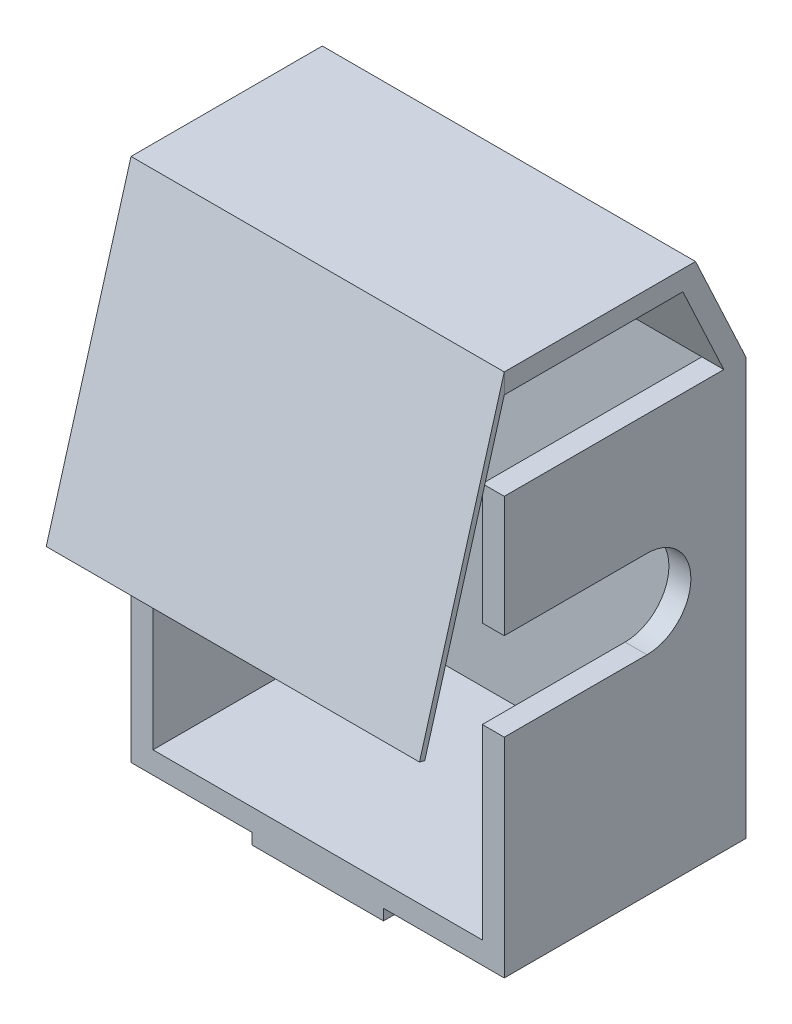
ISO-10303-21;
HEADER;
FILE_DESCRIPTION(('STEP AP214'),'2;1');
FILE_NAME('part.step','',(''),(''),'','','');
FILE_SCHEMA(('AUTOMOTIVE_DESIGN { 1 0 10303 214 1 1 1 1 }'));
ENDSEC;
DATA;
#1=APPLICATION_CONTEXT('core data for automotive mechanical design processes');
#2=APPLICATION_PROTOCOL_DEFINITION('international standard','automotive_design',2000,#1);
#3=PRODUCT_CONTEXT('',#1,'mechanical');
#4=PRODUCT('Part','Part','',(#3));
#5=PRODUCT_RELATED_PRODUCT_CATEGORY('part','',(#4));
#6=PRODUCT_DEFINITION_FORMATION('','',#4);
#7=PRODUCT_DEFINITION_CONTEXT('part definition',#1,'design');
#8=PRODUCT_DEFINITION('design','',#6,#7);
#9=PRODUCT_DEFINITION_SHAPE('','',#8);
#10=(LENGTH_UNIT() NAMED_UNIT(*) SI_UNIT(.MILLI.,.METRE.));
#11=(NAMED_UNIT(*) PLANE_ANGLE_UNIT() SI_UNIT($,.RADIAN.));
#12=(NAMED_UNIT(*) SI_UNIT($,.STERADIAN.) SOLID_ANGLE_UNIT());
#13=UNCERTAINTY_MEASURE_WITH_UNIT(LENGTH_MEASURE(1.E-05),#10,'distance_accuracy_value','');
#14=(GEOMETRIC_REPRESENTATION_CONTEXT(3) GLOBAL_UNCERTAINTY_ASSIGNED_CONTEXT((#13)) GLOBAL_UNIT_ASSIGNED_CONTEXT((#10,
#11,#12)) REPRESENTATION_CONTEXT('',''));
#15=CARTESIAN_POINT('',(0.,0.,0.));
#16=DIRECTION('',(0.,0.,1.));
#17=DIRECTION('',(1.,0.,0.));
#18=AXIS2_PLACEMENT_3D('',#15,#16,#17);
#19=CARTESIAN_POINT('',(-107.95,138.182537295641,115.843331259016));
#20=DIRECTION('',(0.,-0.275844479740626,-0.961202279958086));
#21=DIRECTION('',(0.,0.961202279958086,-0.275844479740626));
#22=AXIS2_PLACEMENT_3D('',#19,#20,#21);
#23=PLANE('',#22);
#24=DIRECTION('',(0.,0.961202279958086,-0.275844479740626));
#25=VECTOR('',#24,1.);
#26=CARTESIAN_POINT('',(107.95,138.182537295641,115.843331259016));
#27=LINE('',#26,#25);
#28=CARTESIAN_POINT('',(107.95,138.182537295641,115.843331259016));
#29=VERTEX_POINT('',#28);
#30=CARTESIAN_POINT('',(107.95,298.45,69.85));
#31=VERTEX_POINT('',#30);
#32=EDGE_CURVE('E124',#29,#31,#27,.T.);
#33=ORIENTED_EDGE('',*,*,#32,.F.);
#34=DIRECTION('',(1.,0.,0.));
#35=VECTOR('',#34,1.);
#36=CARTESIAN_POINT('',(-107.95,138.182537295641,115.843331259016));
#37=LINE('',#36,#35);
#38=CARTESIAN_POINT('',(-107.95,138.182537295641,115.843331259016));
#39=VERTEX_POINT('',#38);
#40=EDGE_CURVE('E12',#39,#29,#37,.T.);
#41=ORIENTED_EDGE('',*,*,#40,.F.);
#42=DIRECTION('',(0.,0.961202279958086,-0.275844479740626));
#43=VECTOR('',#42,1.);
#44=CARTESIAN_POINT('',(-107.95,138.182537295641,115.843331259016));
#45=LINE('',#44,#43);
#46=CARTESIAN_POINT('',(-107.95,298.45,69.85));
#47=VERTEX_POINT('',#46);
#48=EDGE_CURVE('E115',#39,#47,#45,.T.);
#49=ORIENTED_EDGE('',*,*,#48,.T.);
#50=DIRECTION('',(1.,0.,0.));
#51=VECTOR('',#50,1.);
#52=CARTESIAN_POINT('',(-107.95,298.45,69.85));
#53=LINE('',#52,#51);
#54=EDGE_CURVE('E56',#47,#31,#53,.T.);
#55=ORIENTED_EDGE('',*,*,#54,.T.);
#56=EDGE_LOOP('',(#33,#41,#49,#55));
#57=FACE_BOUND('',#56,.T.);
#58=ADVANCED_FACE('F53',(#57),#23,.T.);
#59=CARTESIAN_POINT('',(-107.95,139.058343518818,118.895148497883));
#60=DIRECTION('',(0.,-0.96120227995809,0.275844479740613));
#61=DIRECTION('',(0.,-0.275844479740613,-0.96120227995809));
#62=AXIS2_PLACEMENT_3D('',#59,#60,#61);
#63=PLANE('',#62);
#64=DIRECTION('',(0.,-0.275844479740613,-0.96120227995809));
#65=VECTOR('',#64,1.);
#66=CARTESIAN_POINT('',(107.95,139.058343518818,118.895148497883));
#67=LINE('',#66,#65);
#68=CARTESIAN_POINT('',(107.95,139.058343518818,118.895148497883));
#69=VERTEX_POINT('',#68);
#70=EDGE_CURVE('E119',#69,#29,#67,.T.);
#71=ORIENTED_EDGE('',*,*,#70,.F.);
#72=DIRECTION('',(1.,0.,0.));
#73=VECTOR('',#72,1.);
#74=CARTESIAN_POINT('',(-107.95,139.058343518818,118.895148497883));
#75=LINE('',#74,#73);
#76=CARTESIAN_POINT('',(-107.95,139.058343518818,118.895148497883));
#77=VERTEX_POINT('',#76);
#78=EDGE_CURVE('E63',#77,#69,#75,.T.);
#79=ORIENTED_EDGE('',*,*,#78,.F.);
#80=DIRECTION('',(0.,-0.275844479740613,-0.96120227995809));
#81=VECTOR('',#80,1.);
#82=CARTESIAN_POINT('',(-107.95,139.058343518818,118.895148497883));
#83=LINE('',#82,#81);
#84=EDGE_CURVE('E110',#77,#39,#83,.T.);
#85=ORIENTED_EDGE('',*,*,#84,.T.);
#86=ORIENTED_EDGE('',*,*,#40,.T.);
#87=EDGE_LOOP('',(#71,#79,#85,#86));
#88=FACE_BOUND('',#87,.T.);
#89=ADVANCED_FACE('F146',(#88),#63,.T.);
#90=CARTESIAN_POINT('',(-107.95,309.960108895366,69.85));
#91=DIRECTION('',(0.,0.275844479740626,0.961202279958086));
#92=DIRECTION('',(0.,-0.961202279958086,0.275844479740626));
#93=AXIS2_PLACEMENT_3D('',#90,#91,#92);
#94=PLANE('',#93);
#95=DIRECTION('',(0.,-0.961202279958086,0.275844479740626));
#96=VECTOR('',#95,1.);
#97=CARTESIAN_POINT('',(107.95,309.960108895366,69.85));
#98=LINE('',#97,#96);
#99=CARTESIAN_POINT('',(107.95,309.960108895366,69.85));
#100=VERTEX_POINT('',#99);
#101=EDGE_CURVE('E104',#100,#69,#98,.T.);
#102=ORIENTED_EDGE('',*,*,#101,.F.);
#103=DIRECTION('',(1.,0.,0.));
#104=VECTOR('',#103,1.);
#105=CARTESIAN_POINT('',(-107.95,309.960108895366,69.85));
#106=LINE('',#105,#104);
#107=CARTESIAN_POINT('',(-107.95,309.960108895366,69.85));
#108=VERTEX_POINT('',#107);
#109=EDGE_CURVE('E99',#108,#100,#106,.T.);
#110=ORIENTED_EDGE('',*,*,#109,.F.);
#111=DIRECTION('',(0.,-0.961202279958086,0.275844479740626));
#112=VECTOR('',#111,1.);
#113=CARTESIAN_POINT('',(-107.95,309.960108895366,69.85));
#114=LINE('',#113,#112);
#115=EDGE_CURVE('E102',#108,#77,#114,.T.);
#116=ORIENTED_EDGE('',*,*,#115,.T.);
#117=ORIENTED_EDGE('',*,*,#78,.T.);
#118=EDGE_LOOP('',(#102,#110,#116,#117));
#119=FACE_BOUND('',#118,.T.);
#120=ADVANCED_FACE('F101',(#119),#94,.T.);
#121=CARTESIAN_POINT('',(-107.95,298.45,69.85));
#122=DIRECTION('',(0.,0.,-1.));
#123=DIRECTION('',(-1.,0.,0.));
#124=AXIS2_PLACEMENT_3D('',#121,#122,#123);
#125=PLANE('',#124);
#126=DIRECTION('',(0.,1.,0.));
#127=VECTOR('',#126,1.);
#128=CARTESIAN_POINT('',(107.95,298.45,69.85));
#129=LINE('',#128,#127);
#130=EDGE_CURVE('E128',#31,#100,#129,.T.);
#131=ORIENTED_EDGE('',*,*,#130,.F.);
#132=ORIENTED_EDGE('',*,*,#54,.F.);
#133=DIRECTION('',(0.,1.,0.));
#134=VECTOR('',#133,1.);
#135=CARTESIAN_POINT('',(-107.95,298.45,69.85));
#136=LINE('',#135,#134);
#137=EDGE_CURVE('E109',#47,#108,#136,.T.);
#138=ORIENTED_EDGE('',*,*,#137,.T.);
#139=ORIENTED_EDGE('',*,*,#109,.T.);
#140=EDGE_LOOP('',(#131,#132,#138,#139));
#141=FACE_BOUND('',#140,.T.);
#142=ADVANCED_FACE('F113',(#141),#125,.T.);
#143=CARTESIAN_POINT('',(-107.95,0.,0.));
#144=DIRECTION('',(-1.,0.,0.));
#145=DIRECTION('',(0.,0.,1.));
#146=AXIS2_PLACEMENT_3D('',#143,#144,#145);
#147=PLANE('',#146);
#148=ORIENTED_EDGE('',*,*,#48,.F.);
#149=ORIENTED_EDGE('',*,*,#84,.F.);
#150=ORIENTED_EDGE('',*,*,#115,.F.);
#151=ORIENTED_EDGE('',*,*,#137,.F.);
#152=EDGE_LOOP('',(#148,#149,#150,#151));
#153=FACE_BOUND('',#152,.T.);
#154=ADVANCED_FACE('F108',(#153),#147,.T.);
#155=CARTESIAN_POINT('',(107.95,0.,0.));
#156=DIRECTION('',(-1.,0.,0.));
#157=DIRECTION('',(0.,0.,1.));
#158=AXIS2_PLACEMENT_3D('',#155,#156,#157);
#159=PLANE('',#158);
#160=ORIENTED_EDGE('',*,*,#32,.T.);
#161=ORIENTED_EDGE('',*,*,#130,.T.);
#162=ORIENTED_EDGE('',*,*,#101,.T.);
#163=ORIENTED_EDGE('',*,*,#70,.T.);
#164=EDGE_LOOP('',(#160,#161,#162,#163));
#165=FACE_BOUND('',#164,.T.);
#166=ADVANCED_FACE('F145',(#165),#159,.F.);
#167=CLOSED_SHELL('',(#58,#89,#120,#142,#154,#166));
#168=MANIFOLD_SOLID_BREP('B2',#167);
#169=CARTESIAN_POINT('',(0.,0.,69.85));
#170=DIRECTION('',(0.,0.,-1.));
#171=DIRECTION('',(-1.,0.,0.));
#172=AXIS2_PLACEMENT_3D('',#169,#170,#171);
#173=PLANE('',#172);
#174=DIRECTION('',(0.,-1.,0.));
#175=VECTOR('',#174,1.);
#176=CARTESIAN_POINT('',(95.2499999999999,247.65,69.85));
#177=LINE('',#176,#175);
#178=CARTESIAN_POINT('',(95.2499999999999,247.65,69.85));
#179=VERTEX_POINT('',#178);
#180=CARTESIAN_POINT('',(95.2499999999999,177.8,69.85));
#181=VERTEX_POINT('',#180);
#182=EDGE_CURVE('E466',#179,#181,#177,.T.);
#183=ORIENTED_EDGE('',*,*,#182,.T.);
#184=DIRECTION('',(1.,0.,0.));
#185=VECTOR('',#184,1.);
#186=CARTESIAN_POINT('',(-107.951,177.8,69.85));
#187=LINE('',#186,#185);
#188=CARTESIAN_POINT('',(107.95,177.8,69.85));
#189=VERTEX_POINT('',#188);
#190=EDGE_CURVE('E369',#181,#189,#187,.T.);
#191=ORIENTED_EDGE('',*,*,#190,.T.);
#192=DIRECTION('',(0.,1.,0.));
#193=VECTOR('',#192,1.);
#194=CARTESIAN_POINT('',(107.95,19.05,69.85));
#195=LINE('',#194,#193);
#196=CARTESIAN_POINT('',(107.95,247.65,69.85));
#197=VERTEX_POINT('',#196);
#198=EDGE_CURVE('E491',#189,#197,#195,.T.);
#199=ORIENTED_EDGE('',*,*,#198,.T.);
#200=DIRECTION('',(1.,0.,0.));
#201=VECTOR('',#200,1.);
#202=CARTESIAN_POINT('',(107.95,247.65,69.85));
#203=LINE('',#202,#201);
#204=EDGE_CURVE('E453',#179,#197,#203,.T.);
#205=ORIENTED_EDGE('',*,*,#204,.F.);
#206=EDGE_LOOP('',(#183,#191,#199,#205));
#207=FACE_BOUND('',#206,.T.);
#208=ADVANCED_FACE('F189',(#207),#173,.F.);
#209=CARTESIAN_POINT('',(0.,247.65,0.));
#210=DIRECTION('',(0.,1.,0.));
#211=DIRECTION('',(0.,0.,1.));
#212=AXIS2_PLACEMENT_3D('',#209,#210,#211);
#213=PLANE('',#212);
#214=DIRECTION('',(1.,0.,0.));
#215=VECTOR('',#214,1.);
#216=CARTESIAN_POINT('',(-107.95,247.65,-57.15));
#217=LINE('',#216,#215);
#218=CARTESIAN_POINT('',(-107.95,247.65,-57.15));
#219=VERTEX_POINT('',#218);
#220=CARTESIAN_POINT('',(-95.25,247.65,-57.15));
#221=VERTEX_POINT('',#220);
#222=EDGE_CURVE('E200',#219,#221,#217,.T.);
#223=ORIENTED_EDGE('',*,*,#222,.F.);
#224=DIRECTION('',(0.,0.,1.));
#225=VECTOR('',#224,1.);
#226=CARTESIAN_POINT('',(-107.95,247.65,-69.85));
#227=LINE('',#226,#225);
#228=CARTESIAN_POINT('',(-107.95,247.65,69.85));
#229=VERTEX_POINT('',#228);
#230=EDGE_CURVE('E437',#219,#229,#227,.T.);
#231=ORIENTED_EDGE('',*,*,#230,.T.);
#232=DIRECTION('',(1.,0.,0.));
#233=VECTOR('',#232,1.);
#234=CARTESIAN_POINT('',(-107.95,247.65,69.85));
#235=LINE('',#234,#233);
#236=CARTESIAN_POINT('',(-95.25,247.65,69.85));
#237=VERTEX_POINT('',#236);
#238=EDGE_CURVE('E440',#229,#237,#235,.T.);
#239=ORIENTED_EDGE('',*,*,#238,.T.);
#240=DIRECTION('',(0.,0.,-1.));
#241=VECTOR('',#240,1.);
#242=CARTESIAN_POINT('',(-95.25,247.65,-57.15));
#243=LINE('',#242,#241);
#244=EDGE_CURVE('E443',#237,#221,#243,.T.);
#245=ORIENTED_EDGE('',*,*,#244,.T.);
#246=EDGE_LOOP('',(#223,#231,#239,#245));
#247=FACE_BOUND('',#246,.T.);
#248=ADVANCED_FACE('F689',(#247),#213,.T.);
#249=CARTESIAN_POINT('',(-107.95,19.05,69.85));
#250=DIRECTION('',(0.,-1.,0.));
#251=DIRECTION('',(0.,0.,-1.));
#252=AXIS2_PLACEMENT_3D('',#249,#250,#251);
#253=PLANE('',#252);
#254=DIRECTION('',(0.,0.,1.));
#255=VECTOR('',#254,1.);
#256=CARTESIAN_POINT('',(95.2499999999999,19.05,69.85));
#257=LINE('',#256,#255);
#258=CARTESIAN_POINT('',(95.2499999999999,19.05,-57.15));
#259=VERTEX_POINT('',#258);
#260=CARTESIAN_POINT('',(95.2500000000001,19.05,69.85));
#261=VERTEX_POINT('',#260);
#262=EDGE_CURVE('E433',#259,#261,#257,.T.);
#263=ORIENTED_EDGE('',*,*,#262,.F.);
#264=DIRECTION('',(1.,0.,0.));
#265=VECTOR('',#264,1.);
#266=CARTESIAN_POINT('',(95.2499999999999,19.05,-57.15));
#267=LINE('',#266,#265);
#268=CARTESIAN_POINT('',(-95.25,19.05,-57.15));
#269=VERTEX_POINT('',#268);
#270=EDGE_CURVE('E460',#269,#259,#267,.T.);
#271=ORIENTED_EDGE('',*,*,#270,.F.);
#272=DIRECTION('',(0.,0.,-1.));
#273=VECTOR('',#272,1.);
#274=CARTESIAN_POINT('',(-95.25,19.05,-57.15));
#275=LINE('',#274,#273);
#276=CARTESIAN_POINT('',(-95.25,19.05,69.85));
#277=VERTEX_POINT('',#276);
#278=EDGE_CURVE('E418',#277,#269,#275,.T.);
#279=ORIENTED_EDGE('',*,*,#278,.F.);
#280=DIRECTION('',(-1.,0.,0.));
#281=VECTOR('',#280,1.);
#282=CARTESIAN_POINT('',(-107.95,19.05,69.85));
#283=LINE('',#282,#281);
#284=EDGE_CURVE('E496',#261,#277,#283,.T.);
#285=ORIENTED_EDGE('',*,*,#284,.F.);
#286=EDGE_LOOP('',(#263,#271,#279,#285));
#287=FACE_BOUND('',#286,.T.);
#288=ADVANCED_FACE('F664',(#287),#253,.F.);
#289=CARTESIAN_POINT('',(38.1,6.34999999999997,69.85));
#290=DIRECTION('',(-1.,0.,0.));
#291=DIRECTION('',(0.,0.,1.));
#292=AXIS2_PLACEMENT_3D('',#289,#290,#291);
#293=PLANE('',#292);
#294=DIRECTION('',(0.,1.,0.));
#295=VECTOR('',#294,1.);
#296=CARTESIAN_POINT('',(38.1,6.34999999999997,-69.85));
#297=LINE('',#296,#295);
#298=CARTESIAN_POINT('',(38.1,0.,-69.85));
#299=VERTEX_POINT('',#298);
#300=CARTESIAN_POINT('',(38.1,6.34999999999997,-69.85));
#301=VERTEX_POINT('',#300);
#302=EDGE_CURVE('E482',#299,#301,#297,.T.);
#303=ORIENTED_EDGE('',*,*,#302,.T.);
#304=DIRECTION('',(0.,0.,-1.));
#305=VECTOR('',#304,1.);
#306=CARTESIAN_POINT('',(38.1,6.34999999999997,69.85));
#307=LINE('',#306,#305);
#308=CARTESIAN_POINT('',(38.1,6.34999999999997,69.85));
#309=VERTEX_POINT('',#308);
#310=EDGE_CURVE('E193',#309,#301,#307,.T.);
#311=ORIENTED_EDGE('',*,*,#310,.F.);
#312=DIRECTION('',(0.,1.,0.));
#313=VECTOR('',#312,1.);
#314=CARTESIAN_POINT('',(38.1,6.34999999999997,69.85));
#315=LINE('',#314,#313);
#316=CARTESIAN_POINT('',(38.1,0.,69.85));
#317=VERTEX_POINT('',#316);
#318=EDGE_CURVE('E483',#317,#309,#315,.T.);
#319=ORIENTED_EDGE('',*,*,#318,.F.);
#320=DIRECTION('',(0.,0.,-1.));
#321=VECTOR('',#320,1.);
#322=CARTESIAN_POINT('',(38.1,0.,69.85));
#323=LINE('',#322,#321);
#324=EDGE_CURVE('E512',#317,#299,#323,.T.);
#325=ORIENTED_EDGE('',*,*,#324,.T.);
#326=EDGE_LOOP('',(#303,#311,#319,#325));
#327=FACE_BOUND('',#326,.T.);
#328=ADVANCED_FACE('F191',(#327),#293,.F.);
#329=CARTESIAN_POINT('',(107.95,6.34999999999997,69.85));
#330=DIRECTION('',(0.,1.,0.));
#331=DIRECTION('',(-1.,0.,0.));
#332=AXIS2_PLACEMENT_3D('',#329,#330,#331);
#333=PLANE('',#332);
#334=DIRECTION('',(1.,0.,0.));
#335=VECTOR('',#334,1.);
#336=CARTESIAN_POINT('',(107.95,6.34999999999997,-69.85));
#337=LINE('',#336,#335);
#338=CARTESIAN_POINT('',(107.95,6.34999999999997,-69.85));
#339=VERTEX_POINT('',#338);
#340=EDGE_CURVE('E516',#301,#339,#337,.T.);
#341=ORIENTED_EDGE('',*,*,#340,.T.);
#342=DIRECTION('',(0.,0.,-1.));
#343=VECTOR('',#342,1.);
#344=CARTESIAN_POINT('',(107.95,6.34999999999997,69.85));
#345=LINE('',#344,#343);
#346=CARTESIAN_POINT('',(107.95,6.34999999999997,69.85));
#347=VERTEX_POINT('',#346);
#348=EDGE_CURVE('E547',#347,#339,#345,.T.);
#349=ORIENTED_EDGE('',*,*,#348,.F.);
#350=DIRECTION('',(1.,0.,0.));
#351=VECTOR('',#350,1.);
#352=CARTESIAN_POINT('',(107.95,6.34999999999997,69.85));
#353=LINE('',#352,#351);
#354=EDGE_CURVE('E487',#309,#347,#353,.T.);
#355=ORIENTED_EDGE('',*,*,#354,.F.);
#356=ORIENTED_EDGE('',*,*,#310,.T.);
#357=EDGE_LOOP('',(#341,#349,#355,#356));
#358=FACE_BOUND('',#357,.T.);
#359=ADVANCED_FACE('F560',(#358),#333,.F.);
#360=CARTESIAN_POINT('',(107.95,19.05,69.85));
#361=DIRECTION('',(-1.,0.,0.));
#362=DIRECTION('',(0.,0.,1.));
#363=AXIS2_PLACEMENT_3D('',#360,#361,#362);
#364=PLANE('',#363);
#365=ORIENTED_EDGE('',*,*,#198,.F.);
#366=DIRECTION('',(0.,0.,1.));
#367=VECTOR('',#366,1.);
#368=CARTESIAN_POINT('',(107.95,177.8,-12.7000000000002));
#369=LINE('',#368,#367);
#370=CARTESIAN_POINT('',(107.95,177.8,-12.7000000000002));
#371=VERTEX_POINT('',#370);
#372=EDGE_CURVE('E652',#371,#189,#369,.T.);
#373=ORIENTED_EDGE('',*,*,#372,.F.);
#374=CARTESIAN_POINT('',(107.95,152.4,-12.7000000000002));
#375=DIRECTION('',(1.,0.,0.));
#376=DIRECTION('',(0.,0.,-1.));
#377=AXIS2_PLACEMENT_3D('',#374,#375,#376);
#378=CIRCLE('',#377,25.4);
#379=CARTESIAN_POINT('',(107.95,127.,-12.7000000000002));
#380=VERTEX_POINT('',#379);
#381=EDGE_CURVE('E362',#380,#371,#378,.T.);
#382=ORIENTED_EDGE('',*,*,#381,.F.);
#383=DIRECTION('',(0.,0.,-1.));
#384=VECTOR('',#383,1.);
#385=CARTESIAN_POINT('',(107.95,127.,-12.7000000000002));
#386=LINE('',#385,#384);
#387=CARTESIAN_POINT('',(107.95,127.,69.85));
#388=VERTEX_POINT('',#387);
#389=EDGE_CURVE('E340',#388,#380,#386,.T.);
#390=ORIENTED_EDGE('',*,*,#389,.F.);
#391=EDGE_CURVE('E492',#347,#388,#195,.T.);
#392=ORIENTED_EDGE('',*,*,#391,.F.);
#393=ORIENTED_EDGE('',*,*,#348,.T.);
#394=DIRECTION('',(0.,1.,0.));
#395=VECTOR('',#394,1.);
#396=CARTESIAN_POINT('',(107.95,19.05,-69.85));
#397=LINE('',#396,#395);
#398=CARTESIAN_POINT('',(107.95,247.65,-69.85));
#399=VERTEX_POINT('',#398);
#400=EDGE_CURVE('E519',#339,#399,#397,.T.);
#401=ORIENTED_EDGE('',*,*,#400,.T.);
#402=DIRECTION('',(0.,0.906307787036648,0.422618261740704));
#403=VECTOR('',#402,1.);
#404=CARTESIAN_POINT('',(107.95,247.65,-69.85));
#405=LINE('',#404,#403);
#406=CARTESIAN_POINT('',(107.95,309.960108895366,-40.7943190416187));
#407=VERTEX_POINT('',#406);
#408=EDGE_CURVE('E400',#399,#407,#405,.T.);
#409=ORIENTED_EDGE('',*,*,#408,.T.);
#410=DIRECTION('',(0.,0.,1.));
#411=VECTOR('',#410,1.);
#412=CARTESIAN_POINT('',(107.95,309.960108895366,-40.7943190416187));
#413=LINE('',#412,#411);
#414=CARTESIAN_POINT('',(107.95,309.960108895366,69.85));
#415=VERTEX_POINT('',#414);
#416=EDGE_CURVE('E404',#407,#415,#413,.T.);
#417=ORIENTED_EDGE('',*,*,#416,.T.);
#418=DIRECTION('',(0.,-1.,0.));
#419=VECTOR('',#418,1.);
#420=CARTESIAN_POINT('',(107.95,309.960108895366,69.85));
#421=LINE('',#420,#419);
#422=CARTESIAN_POINT('',(107.95,298.45,69.85));
#423=VERTEX_POINT('',#422);
#424=EDGE_CURVE('E408',#415,#423,#421,.T.);
#425=ORIENTED_EDGE('',*,*,#424,.T.);
#426=DIRECTION('',(0.,0.,-1.));
#427=VECTOR('',#426,1.);
#428=CARTESIAN_POINT('',(107.95,298.45,-33.4615709657258));
#429=LINE('',#428,#427);
#430=CARTESIAN_POINT('',(107.95,298.45,-33.4615709657258));
#431=VERTEX_POINT('',#430);
#432=EDGE_CURVE('E381',#423,#431,#429,.T.);
#433=ORIENTED_EDGE('',*,*,#432,.T.);
#434=DIRECTION('',(0.,-0.906307787036648,-0.422618261740704));
#435=VECTOR('',#434,1.);
#436=CARTESIAN_POINT('',(107.95,247.65,-57.15));
#437=LINE('',#436,#435);
#438=CARTESIAN_POINT('',(107.95,247.65,-57.15));
#439=VERTEX_POINT('',#438);
#440=EDGE_CURVE('E375',#431,#439,#437,.T.);
#441=ORIENTED_EDGE('',*,*,#440,.T.);
#442=DIRECTION('',(0.,0.,-1.));
#443=VECTOR('',#442,1.);
#444=CARTESIAN_POINT('',(107.95,247.65,69.85));
#445=LINE('',#444,#443);
#446=EDGE_CURVE('E429',#197,#439,#445,.T.);
#447=ORIENTED_EDGE('',*,*,#446,.F.);
#448=EDGE_LOOP('',(#365,#373,#382,#390,#392,#393,#401,#409,#417,#425,#433,#441,#447));
#449=FACE_BOUND('',#448,.T.);
#450=ADVANCED_FACE('F572',(#449),#364,.F.);
#451=CARTESIAN_POINT('',(-107.95,19.05,69.85));
#452=DIRECTION('',(1.,0.,0.));
#453=DIRECTION('',(0.,0.,-1.));
#454=AXIS2_PLACEMENT_3D('',#451,#452,#453);
#455=PLANE('',#454);
#456=DIRECTION('',(0.,-1.,0.));
#457=VECTOR('',#456,1.);
#458=CARTESIAN_POINT('',(-107.95,19.05,-69.85));
#459=LINE('',#458,#457);
#460=CARTESIAN_POINT('',(-107.95,247.65,-69.85));
#461=VERTEX_POINT('',#460);
#462=CARTESIAN_POINT('',(-107.95,6.34999999999997,-69.85));
#463=VERTEX_POINT('',#462);
#464=EDGE_CURVE('E522',#461,#463,#459,.T.);
#465=ORIENTED_EDGE('',*,*,#464,.T.);
#466=DIRECTION('',(0.,0.,-1.));
#467=VECTOR('',#466,1.);
#468=CARTESIAN_POINT('',(-107.95,6.34999999999997,69.85));
#469=LINE('',#468,#467);
#470=CARTESIAN_POINT('',(-107.95,6.34999999999997,69.85));
#471=VERTEX_POINT('',#470);
#472=EDGE_CURVE('E544',#471,#463,#469,.T.);
#473=ORIENTED_EDGE('',*,*,#472,.F.);
#474=DIRECTION('',(0.,-1.,0.));
#475=VECTOR('',#474,1.);
#476=CARTESIAN_POINT('',(-107.95,19.05,69.85));
#477=LINE('',#476,#475);
#478=EDGE_CURVE('E500',#229,#471,#477,.T.);
#479=ORIENTED_EDGE('',*,*,#478,.F.);
#480=ORIENTED_EDGE('',*,*,#230,.F.);
#481=DIRECTION('',(0.,-0.906307787036648,-0.422618261740704));
#482=VECTOR('',#481,1.);
#483=CARTESIAN_POINT('',(-107.95,247.65,-57.15));
#484=LINE('',#483,#482);
#485=CARTESIAN_POINT('',(-107.95,298.45,-33.4615709657258));
#486=VERTEX_POINT('',#485);
#487=EDGE_CURVE('E376',#486,#219,#484,.T.);
#488=ORIENTED_EDGE('',*,*,#487,.F.);
#489=DIRECTION('',(0.,0.,-1.));
#490=VECTOR('',#489,1.);
#491=CARTESIAN_POINT('',(-107.95,298.45,-33.4615709657258));
#492=LINE('',#491,#490);
#493=CARTESIAN_POINT('',(-107.95,298.45,69.85));
#494=VERTEX_POINT('',#493);
#495=EDGE_CURVE('E393',#494,#486,#492,.T.);
#496=ORIENTED_EDGE('',*,*,#495,.F.);
#497=DIRECTION('',(0.,-1.,0.));
#498=VECTOR('',#497,1.);
#499=CARTESIAN_POINT('',(-107.95,309.960108895366,69.85));
#500=LINE('',#499,#498);
#501=CARTESIAN_POINT('',(-107.95,309.960108895366,69.85));
#502=VERTEX_POINT('',#501);
#503=EDGE_CURVE('E389',#502,#494,#500,.T.);
#504=ORIENTED_EDGE('',*,*,#503,.F.);
#505=DIRECTION('',(0.,0.,1.));
#506=VECTOR('',#505,1.);
#507=CARTESIAN_POINT('',(-107.95,309.960108895366,-40.7943190416187));
#508=LINE('',#507,#506);
#509=CARTESIAN_POINT('',(-107.95,309.960108895366,-40.7943190416187));
#510=VERTEX_POINT('',#509);
#511=EDGE_CURVE('E385',#510,#502,#508,.T.);
#512=ORIENTED_EDGE('',*,*,#511,.F.);
#513=DIRECTION('',(0.,0.906307787036648,0.422618261740704));
#514=VECTOR('',#513,1.);
#515=CARTESIAN_POINT('',(-107.95,247.65,-69.85));
#516=LINE('',#515,#514);
#517=EDGE_CURVE('E380',#461,#510,#516,.T.);
#518=ORIENTED_EDGE('',*,*,#517,.F.);
#519=EDGE_LOOP('',(#465,#473,#479,#480,#488,#496,#504,#512,#518));
#520=FACE_BOUND('',#519,.T.);
#521=ADVANCED_FACE('F688',(#520),#455,.F.);
#522=CARTESIAN_POINT('',(-107.95,6.34999999999997,69.85));
#523=DIRECTION('',(0.,1.,0.));
#524=DIRECTION('',(-1.,0.,0.));
#525=AXIS2_PLACEMENT_3D('',#522,#523,#524);
#526=PLANE('',#525);
#527=DIRECTION('',(1.,0.,0.));
#528=VECTOR('',#527,1.);
#529=CARTESIAN_POINT('',(-107.95,6.34999999999997,-69.85));
#530=LINE('',#529,#528);
#531=CARTESIAN_POINT('',(-38.1,6.34999999999997,-69.85));
#532=VERTEX_POINT('',#531);
#533=EDGE_CURVE('E525',#463,#532,#530,.T.);
#534=ORIENTED_EDGE('',*,*,#533,.T.);
#535=DIRECTION('',(0.,0.,-1.));
#536=VECTOR('',#535,1.);
#537=CARTESIAN_POINT('',(-38.1,6.34999999999997,69.85));
#538=LINE('',#537,#536);
#539=CARTESIAN_POINT('',(-38.1,6.34999999999997,69.85));
#540=VERTEX_POINT('',#539);
#541=EDGE_CURVE('E540',#540,#532,#538,.T.);
#542=ORIENTED_EDGE('',*,*,#541,.F.);
#543=DIRECTION('',(1.,0.,0.));
#544=VECTOR('',#543,1.);
#545=CARTESIAN_POINT('',(-107.95,6.34999999999997,69.85));
#546=LINE('',#545,#544);
#547=EDGE_CURVE('E503',#471,#540,#546,.T.);
#548=ORIENTED_EDGE('',*,*,#547,.F.);
#549=ORIENTED_EDGE('',*,*,#472,.T.);
#550=EDGE_LOOP('',(#534,#542,#548,#549));
#551=FACE_BOUND('',#550,.T.);
#552=ADVANCED_FACE('F683',(#551),#526,.F.);
#553=CARTESIAN_POINT('',(-38.1,6.34999999999997,69.85));
#554=DIRECTION('',(1.,0.,0.));
#555=DIRECTION('',(0.,0.,-1.));
#556=AXIS2_PLACEMENT_3D('',#553,#554,#555);
#557=PLANE('',#556);
#558=DIRECTION('',(0.,-1.,0.));
#559=VECTOR('',#558,1.);
#560=CARTESIAN_POINT('',(-38.1,6.34999999999997,-69.85));
#561=LINE('',#560,#559);
#562=CARTESIAN_POINT('',(-38.1,0.,-69.85));
#563=VERTEX_POINT('',#562);
#564=EDGE_CURVE('E528',#532,#563,#561,.T.);
#565=ORIENTED_EDGE('',*,*,#564,.T.);
#566=DIRECTION('',(0.,0.,-1.));
#567=VECTOR('',#566,1.);
#568=CARTESIAN_POINT('',(-38.1,0.,69.85));
#569=LINE('',#568,#567);
#570=CARTESIAN_POINT('',(-38.1,0.,69.85));
#571=VERTEX_POINT('',#570);
#572=EDGE_CURVE('E536',#571,#563,#569,.T.);
#573=ORIENTED_EDGE('',*,*,#572,.F.);
#574=DIRECTION('',(0.,-1.,0.));
#575=VECTOR('',#574,1.);
#576=CARTESIAN_POINT('',(-38.1,6.34999999999997,69.85));
#577=LINE('',#576,#575);
#578=EDGE_CURVE('E506',#540,#571,#577,.T.);
#579=ORIENTED_EDGE('',*,*,#578,.F.);
#580=ORIENTED_EDGE('',*,*,#541,.T.);
#581=EDGE_LOOP('',(#565,#573,#579,#580));
#582=FACE_BOUND('',#581,.T.);
#583=ADVANCED_FACE('F679',(#582),#557,.F.);
#584=CARTESIAN_POINT('',(38.1,0.,69.85));
#585=DIRECTION('',(0.,1.,0.));
#586=DIRECTION('',(0.,0.,1.));
#587=AXIS2_PLACEMENT_3D('',#584,#585,#586);
#588=PLANE('',#587);
#589=DIRECTION('',(1.,0.,0.));
#590=VECTOR('',#589,1.);
#591=CARTESIAN_POINT('',(38.1,0.,-69.85));
#592=LINE('',#591,#590);
#593=EDGE_CURVE('E488',#563,#299,#592,.T.);
#594=ORIENTED_EDGE('',*,*,#593,.T.);
#595=ORIENTED_EDGE('',*,*,#324,.F.);
#596=DIRECTION('',(1.,0.,0.));
#597=VECTOR('',#596,1.);
#598=CARTESIAN_POINT('',(38.1,0.,69.85));
#599=LINE('',#598,#597);
#600=EDGE_CURVE('E509',#571,#317,#599,.T.);
#601=ORIENTED_EDGE('',*,*,#600,.F.);
#602=ORIENTED_EDGE('',*,*,#572,.T.);
#603=EDGE_LOOP('',(#594,#595,#601,#602));
#604=FACE_BOUND('',#603,.T.);
#605=ADVANCED_FACE('F677',(#604),#588,.F.);
#606=ORIENTED_EDGE('',*,*,#391,.T.);
#607=DIRECTION('',(1.,0.,0.));
#608=VECTOR('',#607,1.);
#609=CARTESIAN_POINT('',(-107.951,127.,69.85));
#610=LINE('',#609,#608);
#611=CARTESIAN_POINT('',(95.2499999999999,127.,69.85));
#612=VERTEX_POINT('',#611);
#613=EDGE_CURVE('E346',#612,#388,#610,.T.);
#614=ORIENTED_EDGE('',*,*,#613,.F.);
#615=EDGE_CURVE('E357',#612,#261,#177,.T.);
#616=ORIENTED_EDGE('',*,*,#615,.T.);
#617=ORIENTED_EDGE('',*,*,#284,.T.);
#618=DIRECTION('',(0.,-1.,0.));
#619=VECTOR('',#618,1.);
#620=CARTESIAN_POINT('',(-95.25,247.65,69.85));
#621=LINE('',#620,#619);
#622=EDGE_CURVE('E478',#237,#277,#621,.T.);
#623=ORIENTED_EDGE('',*,*,#622,.F.);
#624=ORIENTED_EDGE('',*,*,#238,.F.);
#625=ORIENTED_EDGE('',*,*,#478,.T.);
#626=ORIENTED_EDGE('',*,*,#547,.T.);
#627=ORIENTED_EDGE('',*,*,#578,.T.);
#628=ORIENTED_EDGE('',*,*,#600,.T.);
#629=ORIENTED_EDGE('',*,*,#318,.T.);
#630=ORIENTED_EDGE('',*,*,#354,.T.);
#631=EDGE_LOOP('',(#606,#614,#616,#617,#623,#624,#625,#626,#627,#628,#629,#630));
#632=FACE_BOUND('',#631,.T.);
#633=ADVANCED_FACE('F672',(#632),#173,.F.);
#634=CARTESIAN_POINT('',(0.,0.,-69.85));
#635=DIRECTION('',(0.,0.,-1.));
#636=DIRECTION('',(-1.,0.,0.));
#637=AXIS2_PLACEMENT_3D('',#634,#635,#636);
#638=PLANE('',#637);
#639=ORIENTED_EDGE('',*,*,#302,.F.);
#640=ORIENTED_EDGE('',*,*,#593,.F.);
#641=ORIENTED_EDGE('',*,*,#564,.F.);
#642=ORIENTED_EDGE('',*,*,#533,.F.);
#643=ORIENTED_EDGE('',*,*,#464,.F.);
#644=DIRECTION('',(-1.,0.,0.));
#645=VECTOR('',#644,1.);
#646=CARTESIAN_POINT('',(107.95,247.65,-69.85));
#647=LINE('',#646,#645);
#648=EDGE_CURVE('E432',#399,#461,#647,.T.);
#649=ORIENTED_EDGE('',*,*,#648,.F.);
#650=ORIENTED_EDGE('',*,*,#400,.F.);
#651=ORIENTED_EDGE('',*,*,#340,.F.);
#652=EDGE_LOOP('',(#639,#640,#641,#642,#643,#649,#650,#651));
#653=FACE_BOUND('',#652,.T.);
#654=ADVANCED_FACE('F567',(#653),#638,.T.);
#655=CARTESIAN_POINT('',(-95.25,247.65,-57.15));
#656=DIRECTION('',(-1.,0.,0.));
#657=DIRECTION('',(0.,0.,1.));
#658=AXIS2_PLACEMENT_3D('',#655,#656,#657);
#659=PLANE('',#658);
#660=ORIENTED_EDGE('',*,*,#278,.T.);
#661=DIRECTION('',(0.,-1.,0.));
#662=VECTOR('',#661,1.);
#663=CARTESIAN_POINT('',(-95.25,247.65,-57.15));
#664=LINE('',#663,#662);
#665=EDGE_CURVE('E474',#221,#269,#664,.T.);
#666=ORIENTED_EDGE('',*,*,#665,.F.);
#667=ORIENTED_EDGE('',*,*,#244,.F.);
#668=ORIENTED_EDGE('',*,*,#622,.T.);
#669=EDGE_LOOP('',(#660,#666,#667,#668));
#670=FACE_BOUND('',#669,.T.);
#671=ADVANCED_FACE('F667',(#670),#659,.F.);
#672=CARTESIAN_POINT('',(95.2499999999999,247.65,-57.15));
#673=DIRECTION('',(0.,0.,-1.));
#674=DIRECTION('',(-1.,0.,0.));
#675=AXIS2_PLACEMENT_3D('',#672,#673,#674);
#676=PLANE('',#675);
#677=ORIENTED_EDGE('',*,*,#270,.T.);
#678=DIRECTION('',(0.,-1.,0.));
#679=VECTOR('',#678,1.);
#680=CARTESIAN_POINT('',(95.2499999999999,247.65,-57.15));
#681=LINE('',#680,#679);
#682=CARTESIAN_POINT('',(95.2499999999999,247.65,-57.15));
#683=VERTEX_POINT('',#682);
#684=EDGE_CURVE('E470',#683,#259,#681,.T.);
#685=ORIENTED_EDGE('',*,*,#684,.F.);
#686=DIRECTION('',(1.,0.,0.));
#687=VECTOR('',#686,1.);
#688=CARTESIAN_POINT('',(95.2499999999999,247.65,-57.15));
#689=LINE('',#688,#687);
#690=EDGE_CURVE('E446',#221,#683,#689,.T.);
#691=ORIENTED_EDGE('',*,*,#690,.F.);
#692=ORIENTED_EDGE('',*,*,#665,.T.);
#693=EDGE_LOOP('',(#677,#685,#691,#692));
#694=FACE_BOUND('',#693,.T.);
#695=ADVANCED_FACE('F661',(#694),#676,.F.);
#696=CARTESIAN_POINT('',(95.2499999999999,247.65,69.85));
#697=DIRECTION('',(1.,0.,0.));
#698=DIRECTION('',(0.,0.,-1.));
#699=AXIS2_PLACEMENT_3D('',#696,#697,#698);
#700=PLANE('',#699);
#701=CARTESIAN_POINT('',(95.2499999999999,152.4,-12.7000000000002));
#702=DIRECTION('',(1.,0.,0.));
#703=DIRECTION('',(0.,0.,-1.));
#704=AXIS2_PLACEMENT_3D('',#701,#702,#703);
#705=CIRCLE('',#704,25.4);
#706=CARTESIAN_POINT('',(95.2499999999999,177.8,-12.7000000000002));
#707=VERTEX_POINT('',#706);
#708=CARTESIAN_POINT('',(95.2499999999999,127.,-12.7000000000002));
#709=VERTEX_POINT('',#708);
#710=EDGE_CURVE('E349',#707,#709,#705,.F.);
#711=ORIENTED_EDGE('',*,*,#710,.F.);
#712=DIRECTION('',(0.,0.,-1.));
#713=VECTOR('',#712,1.);
#714=CARTESIAN_POINT('',(95.2499999999999,177.8,-12.7000000000002));
#715=LINE('',#714,#713);
#716=EDGE_CURVE('E207',#181,#707,#715,.T.);
#717=ORIENTED_EDGE('',*,*,#716,.F.);
#718=ORIENTED_EDGE('',*,*,#182,.F.);
#719=DIRECTION('',(0.,0.,1.));
#720=VECTOR('',#719,1.);
#721=CARTESIAN_POINT('',(95.2499999999999,247.65,69.85));
#722=LINE('',#721,#720);
#723=EDGE_CURVE('E450',#683,#179,#722,.T.);
#724=ORIENTED_EDGE('',*,*,#723,.F.);
#725=ORIENTED_EDGE('',*,*,#684,.T.);
#726=ORIENTED_EDGE('',*,*,#262,.T.);
#727=ORIENTED_EDGE('',*,*,#615,.F.);
#728=DIRECTION('',(0.,0.,1.));
#729=VECTOR('',#728,1.);
#730=CARTESIAN_POINT('',(95.2499999999999,127.,-12.7000000000002));
#731=LINE('',#730,#729);
#732=EDGE_CURVE('E337',#709,#612,#731,.T.);
#733=ORIENTED_EDGE('',*,*,#732,.F.);
#734=EDGE_LOOP('',(#711,#717,#718,#724,#725,#726,#727,#733));
#735=FACE_BOUND('',#734,.T.);
#736=ADVANCED_FACE('F355',(#735),#700,.F.);
#737=EDGE_CURVE('E51',#683,#439,#217,.T.);
#738=ORIENTED_EDGE('',*,*,#737,.F.);
#739=ORIENTED_EDGE('',*,*,#723,.T.);
#740=ORIENTED_EDGE('',*,*,#204,.T.);
#741=ORIENTED_EDGE('',*,*,#446,.T.);
#742=EDGE_LOOP('',(#738,#739,#740,#741));
#743=FACE_BOUND('',#742,.T.);
#744=ADVANCED_FACE('F595',(#743),#213,.T.);
#745=CARTESIAN_POINT('',(-107.95,247.65,-57.15));
#746=DIRECTION('',(0.,-0.422618261740704,0.906307787036648));
#747=DIRECTION('',(0.,-0.906307787036648,-0.422618261740704));
#748=AXIS2_PLACEMENT_3D('',#745,#746,#747);
#749=PLANE('',#748);
#750=ORIENTED_EDGE('',*,*,#440,.F.);
#751=DIRECTION('',(1.,0.,0.));
#752=VECTOR('',#751,1.);
#753=CARTESIAN_POINT('',(-107.95,298.45,-33.4615709657258));
#754=LINE('',#753,#752);
#755=EDGE_CURVE('E415',#486,#431,#754,.T.);
#756=ORIENTED_EDGE('',*,*,#755,.F.);
#757=ORIENTED_EDGE('',*,*,#487,.T.);
#758=ORIENTED_EDGE('',*,*,#222,.T.);
#759=ORIENTED_EDGE('',*,*,#690,.T.);
#760=ORIENTED_EDGE('',*,*,#737,.T.);
#761=EDGE_LOOP('',(#750,#756,#757,#758,#759,#760));
#762=FACE_BOUND('',#761,.T.);
#763=ADVANCED_FACE('F591',(#762),#749,.T.);
#764=CARTESIAN_POINT('',(-107.95,298.45,-33.4615709657258));
#765=DIRECTION('',(0.,-1.,0.));
#766=DIRECTION('',(0.,0.,-1.));
#767=AXIS2_PLACEMENT_3D('',#764,#765,#766);
#768=PLANE('',#767);
#769=ORIENTED_EDGE('',*,*,#432,.F.);
#770=DIRECTION('',(1.,0.,0.));
#771=VECTOR('',#770,1.);
#772=CARTESIAN_POINT('',(-107.95,298.45,69.85));
#773=LINE('',#772,#771);
#774=EDGE_CURVE('E419',#494,#423,#773,.T.);
#775=ORIENTED_EDGE('',*,*,#774,.F.);
#776=ORIENTED_EDGE('',*,*,#495,.T.);
#777=ORIENTED_EDGE('',*,*,#755,.T.);
#778=EDGE_LOOP('',(#769,#775,#776,#777));
#779=FACE_BOUND('',#778,.T.);
#780=ADVANCED_FACE('F586',(#779),#768,.T.);
#781=CARTESIAN_POINT('',(-107.95,309.960108895366,69.85));
#782=DIRECTION('',(0.,0.,1.));
#783=DIRECTION('',(1.,0.,0.));
#784=AXIS2_PLACEMENT_3D('',#781,#782,#783);
#785=PLANE('',#784);
#786=ORIENTED_EDGE('',*,*,#424,.F.);
#787=DIRECTION('',(1.,0.,0.));
#788=VECTOR('',#787,1.);
#789=CARTESIAN_POINT('',(-107.95,309.960108895366,69.85));
#790=LINE('',#789,#788);
#791=EDGE_CURVE('E422',#502,#415,#790,.T.);
#792=ORIENTED_EDGE('',*,*,#791,.F.);
#793=ORIENTED_EDGE('',*,*,#503,.T.);
#794=ORIENTED_EDGE('',*,*,#774,.T.);
#795=EDGE_LOOP('',(#786,#792,#793,#794));
#796=FACE_BOUND('',#795,.T.);
#797=ADVANCED_FACE('F583',(#796),#785,.T.);
#798=CARTESIAN_POINT('',(-107.95,309.960108895366,-40.7943190416187));
#799=DIRECTION('',(0.,1.,0.));
#800=DIRECTION('',(0.,0.,1.));
#801=AXIS2_PLACEMENT_3D('',#798,#799,#800);
#802=PLANE('',#801);
#803=ORIENTED_EDGE('',*,*,#416,.F.);
#804=DIRECTION('',(1.,0.,0.));
#805=VECTOR('',#804,1.);
#806=CARTESIAN_POINT('',(-107.95,309.960108895366,-40.7943190416187));
#807=LINE('',#806,#805);
#808=EDGE_CURVE('E425',#510,#407,#807,.T.);
#809=ORIENTED_EDGE('',*,*,#808,.F.);
#810=ORIENTED_EDGE('',*,*,#511,.T.);
#811=ORIENTED_EDGE('',*,*,#791,.T.);
#812=EDGE_LOOP('',(#803,#809,#810,#811));
#813=FACE_BOUND('',#812,.T.);
#814=ADVANCED_FACE('F579',(#813),#802,.T.);
#815=CARTESIAN_POINT('',(-107.95,247.65,-69.85));
#816=DIRECTION('',(0.,0.422618261740704,-0.906307787036648));
#817=DIRECTION('',(0.,0.906307787036648,0.422618261740704));
#818=AXIS2_PLACEMENT_3D('',#815,#816,#817);
#819=PLANE('',#818);
#820=ORIENTED_EDGE('',*,*,#408,.F.);
#821=ORIENTED_EDGE('',*,*,#648,.T.);
#822=ORIENTED_EDGE('',*,*,#517,.T.);
#823=ORIENTED_EDGE('',*,*,#808,.T.);
#824=EDGE_LOOP('',(#820,#821,#822,#823));
#825=FACE_BOUND('',#824,.T.);
#826=ADVANCED_FACE('F575',(#825),#819,.T.);
#827=CARTESIAN_POINT('',(-107.951,177.8,-12.7000000000002));
#828=DIRECTION('',(0.,1.,0.));
#829=DIRECTION('',(0.,0.,1.));
#830=AXIS2_PLACEMENT_3D('',#827,#828,#829);
#831=PLANE('',#830);
#832=ORIENTED_EDGE('',*,*,#716,.T.);
#833=DIRECTION('',(1.,0.,0.));
#834=VECTOR('',#833,1.);
#835=CARTESIAN_POINT('',(-107.951,177.8,-12.7000000000002));
#836=LINE('',#835,#834);
#837=EDGE_CURVE('E345',#707,#371,#836,.T.);
#838=ORIENTED_EDGE('',*,*,#837,.T.);
#839=ORIENTED_EDGE('',*,*,#372,.T.);
#840=ORIENTED_EDGE('',*,*,#190,.F.);
#841=EDGE_LOOP('',(#832,#838,#839,#840));
#842=FACE_BOUND('',#841,.T.);
#843=ADVANCED_FACE('F658',(#842),#831,.F.);
#844=CARTESIAN_POINT('',(-107.951,127.,-12.7000000000002));
#845=DIRECTION('',(0.,-1.,0.));
#846=DIRECTION('',(0.,0.,-1.));
#847=AXIS2_PLACEMENT_3D('',#844,#845,#846);
#848=PLANE('',#847);
#849=ORIENTED_EDGE('',*,*,#732,.T.);
#850=ORIENTED_EDGE('',*,*,#613,.T.);
#851=ORIENTED_EDGE('',*,*,#389,.T.);
#852=DIRECTION('',(1.,0.,0.));
#853=VECTOR('',#852,1.);
#854=CARTESIAN_POINT('',(-107.951,127.,-12.7000000000002));
#855=LINE('',#854,#853);
#856=EDGE_CURVE('E333',#709,#380,#855,.T.);
#857=ORIENTED_EDGE('',*,*,#856,.F.);
#858=EDGE_LOOP('',(#849,#850,#851,#857));
#859=FACE_BOUND('',#858,.T.);
#860=ADVANCED_FACE('F335',(#859),#848,.F.);
#861=CARTESIAN_POINT('',(-107.951,152.4,-12.7000000000002));
#862=DIRECTION('',(1.,0.,0.));
#863=DIRECTION('',(0.,0.,-1.));
#864=AXIS2_PLACEMENT_3D('',#861,#862,#863);
#865=CYLINDRICAL_SURFACE('',#864,25.4);
#866=ORIENTED_EDGE('',*,*,#710,.T.);
#867=ORIENTED_EDGE('',*,*,#856,.T.);
#868=ORIENTED_EDGE('',*,*,#381,.T.);
#869=ORIENTED_EDGE('',*,*,#837,.F.);
#870=EDGE_LOOP('',(#866,#867,#868,#869));
#871=FACE_BOUND('',#870,.T.);
#872=ADVANCED_FACE('F350',(#871),#865,.F.);
#873=CLOSED_SHELL('',(#208,#248,#288,#328,#359,#450,#521,#552,#583,#605,#633,#654,#671,#695,
#736,#744,#763,#780,#797,#814,#826,#843,#860,#872));
#874=MANIFOLD_SOLID_BREP('B6',#873);
#875=ADVANCED_BREP_SHAPE_REPRESENTATION('',(#18,#168,#874),#14);
#876=SHAPE_DEFINITION_REPRESENTATION(#9,#875);
ENDSEC;
END-ISO-10303-21;
